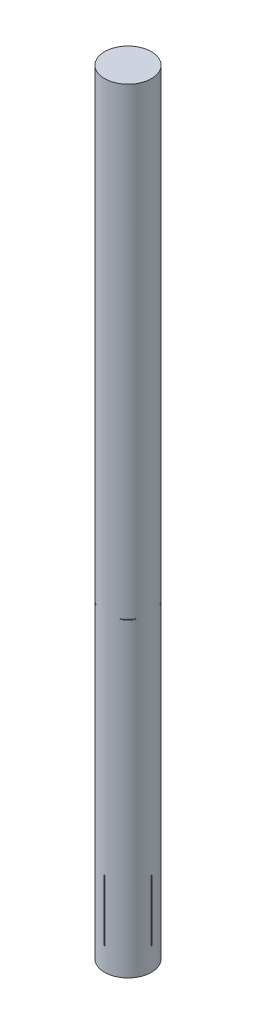
ISO-10303-21;
HEADER;
FILE_DESCRIPTION(('STEP AP214'),'2;1');
FILE_NAME('part.step','',(''),(''),'','','');
FILE_SCHEMA(('AUTOMOTIVE_DESIGN { 1 0 10303 214 1 1 1 1 }'));
ENDSEC;
DATA;
#1=APPLICATION_CONTEXT('core data for automotive mechanical design processes');
#2=APPLICATION_PROTOCOL_DEFINITION('international standard','automotive_design',2000,#1);
#3=PRODUCT_CONTEXT('',#1,'mechanical');
#4=PRODUCT('Part','Part','',(#3));
#5=PRODUCT_RELATED_PRODUCT_CATEGORY('part','',(#4));
#6=PRODUCT_DEFINITION_FORMATION('','',#4);
#7=PRODUCT_DEFINITION_CONTEXT('part definition',#1,'design');
#8=PRODUCT_DEFINITION('design','',#6,#7);
#9=PRODUCT_DEFINITION_SHAPE('','',#8);
#10=(LENGTH_UNIT() NAMED_UNIT(*) SI_UNIT(.MILLI.,.METRE.));
#11=(NAMED_UNIT(*) PLANE_ANGLE_UNIT() SI_UNIT($,.RADIAN.));
#12=(NAMED_UNIT(*) SI_UNIT($,.STERADIAN.) SOLID_ANGLE_UNIT());
#13=UNCERTAINTY_MEASURE_WITH_UNIT(LENGTH_MEASURE(1.E-05),#10,'distance_accuracy_value','');
#14=(GEOMETRIC_REPRESENTATION_CONTEXT(3) GLOBAL_UNCERTAINTY_ASSIGNED_CONTEXT((#13)) GLOBAL_UNIT_ASSIGNED_CONTEXT((#10,
#11,#12)) REPRESENTATION_CONTEXT('',''));
#15=CARTESIAN_POINT('',(0.,0.,0.));
#16=DIRECTION('',(0.,0.,1.));
#17=DIRECTION('',(1.,0.,0.));
#18=AXIS2_PLACEMENT_3D('',#15,#16,#17);
#19=CARTESIAN_POINT('',(0.,2565.4,0.));
#20=DIRECTION('',(0.,1.,0.));
#21=DIRECTION('',(0.,0.,1.));
#22=AXIS2_PLACEMENT_3D('',#19,#20,#21);
#23=PLANE('',#22);
#24=CARTESIAN_POINT('',(0.,2565.4,0.));
#25=DIRECTION('',(0.,1.,0.));
#26=DIRECTION('',(0.,0.,1.));
#27=AXIS2_PLACEMENT_3D('',#24,#25,#26);
#28=CIRCLE('',#27,77.6224);
#29=CARTESIAN_POINT('',(0.,2565.4,77.6224));
#30=VERTEX_POINT('',#29);
#31=EDGE_CURVE('E466',#30,#30,#28,.T.);
#32=ORIENTED_EDGE('',*,*,#31,.T.);
#33=EDGE_LOOP('',(#32));
#34=FACE_BOUND('',#33,.T.);
#35=ADVANCED_FACE('F39',(#34),#23,.T.);
#36=CARTESIAN_POINT('',(0.,0.,0.));
#37=DIRECTION('',(0.,1.,0.));
#38=DIRECTION('',(0.,0.,1.));
#39=AXIS2_PLACEMENT_3D('',#36,#37,#38);
#40=PLANE('',#39);
#41=CARTESIAN_POINT('',(0.,0.,0.));
#42=DIRECTION('',(0.,1.,0.));
#43=DIRECTION('',(0.,0.,1.));
#44=AXIS2_PLACEMENT_3D('',#41,#42,#43);
#45=CIRCLE('',#44,77.6224);
#46=CARTESIAN_POINT('',(0.,0.,77.6224));
#47=VERTEX_POINT('',#46);
#48=EDGE_CURVE('E465',#47,#47,#45,.T.);
#49=ORIENTED_EDGE('',*,*,#48,.F.);
#50=EDGE_LOOP('',(#49));
#51=FACE_BOUND('',#50,.T.);
#52=ADVANCED_FACE('F634',(#51),#40,.F.);
#53=CARTESIAN_POINT('',(0.,2565.4,0.));
#54=DIRECTION('',(0.,-1.,0.));
#55=DIRECTION('',(0.,0.,-1.));
#56=AXIS2_PLACEMENT_3D('',#53,#54,#55);
#57=CYLINDRICAL_SURFACE('',#56,77.6224);
#58=CARTESIAN_POINT('',(0.,1027.43,0.));
#59=DIRECTION('',(0.,-1.,0.));
#60=DIRECTION('',(0.,0.,-1.));
#61=AXIS2_PLACEMENT_3D('',#58,#59,#60);
#62=CIRCLE('',#61,77.6224);
#63=CARTESIAN_POINT('',(-66.6790981378722,1027.43,-39.7383297746638));
#64=VERTEX_POINT('',#63);
#65=CARTESIAN_POINT('',(-39.7383297746654,1027.43,-66.6790981378718));
#66=VERTEX_POINT('',#65);
#67=EDGE_CURVE('E316',#64,#66,#62,.T.);
#68=ORIENTED_EDGE('',*,*,#67,.T.);
#69=DIRECTION('',(0.,-1.,0.));
#70=VECTOR('',#69,1.);
#71=CARTESIAN_POINT('',(-39.7383297746638,2565.4,-66.6790981378728));
#72=LINE('',#71,#70);
#73=CARTESIAN_POINT('',(-39.7383297746654,1030.605,-66.6790981378718));
#74=VERTEX_POINT('',#73);
#75=EDGE_CURVE('E274',#66,#74,#72,.F.);
#76=ORIENTED_EDGE('',*,*,#75,.T.);
#77=CARTESIAN_POINT('',(0.,1030.605,0.));
#78=DIRECTION('',(0.,1.,0.));
#79=DIRECTION('',(0.,0.,1.));
#80=AXIS2_PLACEMENT_3D('',#77,#78,#79);
#81=CIRCLE('',#80,77.6224);
#82=CARTESIAN_POINT('',(-66.6790981378726,1030.605,-39.7383297746641));
#83=VERTEX_POINT('',#82);
#84=EDGE_CURVE('E264',#74,#83,#81,.T.);
#85=ORIENTED_EDGE('',*,*,#84,.T.);
#86=DIRECTION('',(0.,-1.,0.));
#87=VECTOR('',#86,1.);
#88=CARTESIAN_POINT('',(-66.6790981378735,2565.4,-39.7383297746625));
#89=LINE('',#88,#87);
#90=EDGE_CURVE('E312',#83,#64,#89,.T.);
#91=ORIENTED_EDGE('',*,*,#90,.T.);
#92=EDGE_LOOP('',(#68,#76,#85,#91));
#93=FACE_BOUND('',#92,.T.);
#94=CARTESIAN_POINT('',(-39.7383297746628,1027.43,66.6790981378734));
#95=VERTEX_POINT('',#94);
#96=CARTESIAN_POINT('',(-66.6790981378716,1027.43,39.7383297746648));
#97=VERTEX_POINT('',#96);
#98=EDGE_CURVE('E319',#95,#97,#62,.T.);
#99=ORIENTED_EDGE('',*,*,#98,.T.);
#100=DIRECTION('',(0.,-1.,0.));
#101=VECTOR('',#100,1.);
#102=CARTESIAN_POINT('',(-66.6790981378729,2565.4,39.7383297746636));
#103=LINE('',#102,#101);
#104=CARTESIAN_POINT('',(-66.6790981378716,1030.605,39.7383297746648));
#105=VERTEX_POINT('',#104);
#106=EDGE_CURVE('E303',#97,#105,#103,.F.);
#107=ORIENTED_EDGE('',*,*,#106,.T.);
#108=CARTESIAN_POINT('',(-39.738329774664,1030.605,66.6790981378721));
#109=VERTEX_POINT('',#108);
#110=EDGE_CURVE('E307',#105,#109,#81,.T.);
#111=ORIENTED_EDGE('',*,*,#110,.T.);
#112=DIRECTION('',(0.,-1.,0.));
#113=VECTOR('',#112,1.);
#114=CARTESIAN_POINT('',(-39.7383297746628,2565.4,66.6790981378734));
#115=LINE('',#114,#113);
#116=EDGE_CURVE('E284',#109,#95,#115,.T.);
#117=ORIENTED_EDGE('',*,*,#116,.T.);
#118=EDGE_LOOP('',(#99,#107,#111,#117));
#119=FACE_BOUND('',#118,.T.);
#120=CARTESIAN_POINT('',(39.7383297746643,1030.605,66.6790981378725));
#121=VERTEX_POINT('',#120);
#122=CARTESIAN_POINT('',(66.6790981378721,1030.605,39.7383297746649));
#123=VERTEX_POINT('',#122);
#124=EDGE_CURVE('E311',#121,#123,#81,.T.);
#125=ORIENTED_EDGE('',*,*,#124,.T.);
#126=DIRECTION('',(0.,-1.,0.));
#127=VECTOR('',#126,1.);
#128=CARTESIAN_POINT('',(66.679098137873,2565.4,39.7383297746633));
#129=LINE('',#128,#127);
#130=CARTESIAN_POINT('',(66.6790981378721,1027.43,39.7383297746649));
#131=VERTEX_POINT('',#130);
#132=EDGE_CURVE('E323',#123,#131,#129,.T.);
#133=ORIENTED_EDGE('',*,*,#132,.T.);
#134=CARTESIAN_POINT('',(39.7383297746655,1027.43,66.6790981378712));
#135=VERTEX_POINT('',#134);
#136=EDGE_CURVE('E320',#131,#135,#62,.T.);
#137=ORIENTED_EDGE('',*,*,#136,.T.);
#138=DIRECTION('',(0.,-1.,0.));
#139=VECTOR('',#138,1.);
#140=CARTESIAN_POINT('',(39.7383297746643,2565.4,66.6790981378725));
#141=LINE('',#140,#139);
#142=EDGE_CURVE('E278',#135,#121,#141,.F.);
#143=ORIENTED_EDGE('',*,*,#142,.T.);
#144=EDGE_LOOP('',(#125,#133,#137,#143));
#145=FACE_BOUND('',#144,.T.);
#146=CARTESIAN_POINT('',(0.,1027.43,0.));
#147=DIRECTION('',(0.,-1.,0.));
#148=DIRECTION('',(0.,0.,-1.));
#149=AXIS2_PLACEMENT_3D('',#146,#147,#148);
#150=CIRCLE('',#149,77.6224);
#151=CARTESIAN_POINT('',(39.738329774664,1027.43,-66.6790981378721));
#152=VERTEX_POINT('',#151);
#153=CARTESIAN_POINT('',(66.679098137872,1027.43,-39.7383297746651));
#154=VERTEX_POINT('',#153);
#155=EDGE_CURVE('E351',#152,#154,#150,.T.);
#156=ORIENTED_EDGE('',*,*,#155,.T.);
#157=DIRECTION('',(0.,-1.,0.));
#158=VECTOR('',#157,1.);
#159=CARTESIAN_POINT('',(66.6790981378729,2565.4,-39.7383297746636));
#160=LINE('',#159,#158);
#161=CARTESIAN_POINT('',(66.679098137872,1030.605,-39.7383297746651));
#162=VERTEX_POINT('',#161);
#163=EDGE_CURVE('E355',#154,#162,#160,.F.);
#164=ORIENTED_EDGE('',*,*,#163,.T.);
#165=CARTESIAN_POINT('',(0.,1030.605,0.));
#166=DIRECTION('',(0.,1.,0.));
#167=DIRECTION('',(0.,0.,1.));
#168=AXIS2_PLACEMENT_3D('',#165,#166,#167);
#169=CIRCLE('',#168,77.6224);
#170=CARTESIAN_POINT('',(39.7383297746643,1030.605,-66.6790981378724));
#171=VERTEX_POINT('',#170);
#172=EDGE_CURVE('E332',#162,#171,#169,.T.);
#173=ORIENTED_EDGE('',*,*,#172,.T.);
#174=DIRECTION('',(0.,-1.,0.));
#175=VECTOR('',#174,1.);
#176=CARTESIAN_POINT('',(39.7383297746628,2565.4,-66.6790981378734));
#177=LINE('',#176,#175);
#178=EDGE_CURVE('E347',#171,#152,#177,.T.);
#179=ORIENTED_EDGE('',*,*,#178,.T.);
#180=EDGE_LOOP('',(#156,#164,#173,#179));
#181=FACE_BOUND('',#180,.T.);
#182=DIRECTION('',(0.,-1.,0.));
#183=VECTOR('',#182,1.);
#184=CARTESIAN_POINT('',(-77.5858661754672,2565.4,-2.38124999999872));
#185=LINE('',#184,#183);
#186=CARTESIAN_POINT('',(-77.5858661754672,76.2,-2.38124999999949));
#187=VERTEX_POINT('',#186);
#188=CARTESIAN_POINT('',(-77.5858661754672,279.400000000001,-2.38124999999943));
#189=VERTEX_POINT('',#188);
#190=EDGE_CURVE('E426',#187,#189,#185,.F.);
#191=ORIENTED_EDGE('',*,*,#190,.T.);
#192=CARTESIAN_POINT('',(0.,279.400000000001,0.));
#193=DIRECTION('',(0.,1.,0.));
#194=DIRECTION('',(0.,0.,1.));
#195=AXIS2_PLACEMENT_3D('',#192,#193,#194);
#196=CIRCLE('',#195,77.6224);
#197=CARTESIAN_POINT('',(-77.5858661754671,279.400000000001,2.38125000000057));
#198=VERTEX_POINT('',#197);
#199=EDGE_CURVE('E416',#189,#198,#196,.T.);
#200=ORIENTED_EDGE('',*,*,#199,.T.);
#201=DIRECTION('',(0.,-1.,0.));
#202=VECTOR('',#201,1.);
#203=CARTESIAN_POINT('',(-77.5858661754671,2565.4,2.38125000000127));
#204=LINE('',#203,#202);
#205=CARTESIAN_POINT('',(-77.5858661754671,76.2,2.38125000000051));
#206=VERTEX_POINT('',#205);
#207=EDGE_CURVE('E418',#198,#206,#204,.T.);
#208=ORIENTED_EDGE('',*,*,#207,.T.);
#209=CARTESIAN_POINT('',(0.,76.2,0.));
#210=DIRECTION('',(0.,-1.,0.));
#211=DIRECTION('',(0.,0.,-1.));
#212=AXIS2_PLACEMENT_3D('',#209,#210,#211);
#213=CIRCLE('',#212,77.6224);
#214=EDGE_CURVE('E422',#206,#187,#213,.T.);
#215=ORIENTED_EDGE('',*,*,#214,.T.);
#216=EDGE_LOOP('',(#191,#200,#208,#215));
#217=FACE_BOUND('',#216,.T.);
#218=DIRECTION('',(0.,-1.,0.));
#219=VECTOR('',#218,1.);
#220=CARTESIAN_POINT('',(2.381250000001,2565.4,77.5858661754671));
#221=LINE('',#220,#219);
#222=CARTESIAN_POINT('',(2.3812500000003,279.4,77.5858661754671));
#223=VERTEX_POINT('',#222);
#224=CARTESIAN_POINT('',(2.381250000001,76.2,77.5858661754671));
#225=VERTEX_POINT('',#224);
#226=EDGE_CURVE('E405',#223,#225,#221,.T.);
#227=ORIENTED_EDGE('',*,*,#226,.T.);
#228=CARTESIAN_POINT('',(-2.38124999999977,76.2,77.5858661754672));
#229=VERTEX_POINT('',#228);
#230=EDGE_CURVE('E427',#225,#229,#213,.T.);
#231=ORIENTED_EDGE('',*,*,#230,.T.);
#232=DIRECTION('',(0.,-1.,0.));
#233=VECTOR('',#232,1.);
#234=CARTESIAN_POINT('',(-2.38124999999899,2565.4,77.5858661754672));
#235=LINE('',#234,#233);
#236=CARTESIAN_POINT('',(-2.3812499999997,279.4,77.5858661754672));
#237=VERTEX_POINT('',#236);
#238=EDGE_CURVE('E409',#229,#237,#235,.F.);
#239=ORIENTED_EDGE('',*,*,#238,.T.);
#240=EDGE_CURVE('E413',#237,#223,#196,.T.);
#241=ORIENTED_EDGE('',*,*,#240,.T.);
#242=EDGE_LOOP('',(#227,#231,#239,#241));
#243=FACE_BOUND('',#242,.T.);
#244=DIRECTION('',(0.,-1.,0.));
#245=VECTOR('',#244,1.);
#246=CARTESIAN_POINT('',(77.5858661754672,2565.4,-2.38124999999927));
#247=LINE('',#246,#245);
#248=CARTESIAN_POINT('',(77.5858661754672,279.400000000001,-2.38124999999997));
#249=VERTEX_POINT('',#248);
#250=CARTESIAN_POINT('',(77.5858661754672,76.2,-2.38125000000004));
#251=VERTEX_POINT('',#250);
#252=EDGE_CURVE('E431',#249,#251,#247,.T.);
#253=ORIENTED_EDGE('',*,*,#252,.T.);
#254=CARTESIAN_POINT('',(77.5858661754672,76.2,2.38124999999895));
#255=VERTEX_POINT('',#254);
#256=EDGE_CURVE('E423',#251,#255,#213,.T.);
#257=ORIENTED_EDGE('',*,*,#256,.T.);
#258=DIRECTION('',(0.,-1.,0.));
#259=VECTOR('',#258,1.);
#260=CARTESIAN_POINT('',(77.5858661754672,2565.4,2.38124999999818));
#261=LINE('',#260,#259);
#262=CARTESIAN_POINT('',(77.5858661754672,279.4,2.38124999999818));
#263=VERTEX_POINT('',#262);
#264=EDGE_CURVE('E401',#255,#263,#261,.F.);
#265=ORIENTED_EDGE('',*,*,#264,.T.);
#266=EDGE_CURVE('E417',#263,#249,#196,.T.);
#267=ORIENTED_EDGE('',*,*,#266,.T.);
#268=EDGE_LOOP('',(#253,#257,#265,#267));
#269=FACE_BOUND('',#268,.T.);
#270=DIRECTION('',(0.,-1.,0.));
#271=VECTOR('',#270,1.);
#272=CARTESIAN_POINT('',(2.38124999999899,2565.4,-77.5858661754672));
#273=LINE('',#272,#271);
#274=CARTESIAN_POINT('',(2.38124999999977,76.2,-77.5858661754672));
#275=VERTEX_POINT('',#274);
#276=CARTESIAN_POINT('',(2.3812499999997,279.4,-77.5858661754672));
#277=VERTEX_POINT('',#276);
#278=EDGE_CURVE('E461',#275,#277,#273,.F.);
#279=ORIENTED_EDGE('',*,*,#278,.T.);
#280=CARTESIAN_POINT('',(0.,279.4,0.));
#281=DIRECTION('',(0.,1.,0.));
#282=DIRECTION('',(0.,0.,1.));
#283=AXIS2_PLACEMENT_3D('',#280,#281,#282);
#284=CIRCLE('',#283,77.6224);
#285=CARTESIAN_POINT('',(-2.3812500000003,279.4,-77.5858661754672));
#286=VERTEX_POINT('',#285);
#287=EDGE_CURVE('E440',#277,#286,#284,.T.);
#288=ORIENTED_EDGE('',*,*,#287,.T.);
#289=DIRECTION('',(0.,-1.,0.));
#290=VECTOR('',#289,1.);
#291=CARTESIAN_POINT('',(-2.381250000001,2565.4,-77.5858661754671));
#292=LINE('',#291,#290);
#293=CARTESIAN_POINT('',(-2.38125000000024,76.2,-77.5858661754671));
#294=VERTEX_POINT('',#293);
#295=EDGE_CURVE('E454',#286,#294,#292,.T.);
#296=ORIENTED_EDGE('',*,*,#295,.T.);
#297=CARTESIAN_POINT('',(0.,76.2,0.));
#298=DIRECTION('',(0.,-1.,0.));
#299=DIRECTION('',(0.,0.,-1.));
#300=AXIS2_PLACEMENT_3D('',#297,#298,#299);
#301=CIRCLE('',#300,77.6224);
#302=EDGE_CURVE('E458',#294,#275,#301,.T.);
#303=ORIENTED_EDGE('',*,*,#302,.T.);
#304=EDGE_LOOP('',(#279,#288,#296,#303));
#305=FACE_BOUND('',#304,.T.);
#306=ORIENTED_EDGE('',*,*,#31,.F.);
#307=EDGE_LOOP('',(#306));
#308=FACE_BOUND('',#307,.T.);
#309=ORIENTED_EDGE('',*,*,#48,.T.);
#310=EDGE_LOOP('',(#309));
#311=FACE_BOUND('',#310,.T.);
#312=ADVANCED_FACE('F41',(#93,#119,#145,#181,#217,#243,#269,#305,#308,#311),#57,.T.);
#313=CARTESIAN_POINT('',(2.3812499999997,279.4,-77.6224));
#314=DIRECTION('',(1.,0.,0.));
#315=DIRECTION('',(0.,1.,0.));
#316=AXIS2_PLACEMENT_3D('',#313,#314,#315);
#317=PLANE('',#316);
#318=DIRECTION('',(0.,0.,1.));
#319=VECTOR('',#318,1.);
#320=CARTESIAN_POINT('',(2.38124999999977,76.2,-77.6224));
#321=LINE('',#320,#319);
#322=CARTESIAN_POINT('',(2.38124999999977,76.2,-76.162783880564));
#323=VERTEX_POINT('',#322);
#324=EDGE_CURVE('E436',#275,#323,#321,.T.);
#325=ORIENTED_EDGE('',*,*,#324,.T.);
#326=DIRECTION('',(0.,-1.,0.));
#327=VECTOR('',#326,1.);
#328=CARTESIAN_POINT('',(2.38124999999899,2565.4,-76.162783880564));
#329=LINE('',#328,#327);
#330=CARTESIAN_POINT('',(2.3812499999997,279.4,-76.162783880564));
#331=VERTEX_POINT('',#330);
#332=EDGE_CURVE('E485',#323,#331,#329,.F.);
#333=ORIENTED_EDGE('',*,*,#332,.T.);
#334=DIRECTION('',(0.,0.,1.));
#335=VECTOR('',#334,1.);
#336=CARTESIAN_POINT('',(2.3812499999997,279.4,-77.6224));
#337=LINE('',#336,#335);
#338=EDGE_CURVE('E435',#277,#331,#337,.T.);
#339=ORIENTED_EDGE('',*,*,#338,.F.);
#340=ORIENTED_EDGE('',*,*,#278,.F.);
#341=EDGE_LOOP('',(#325,#333,#339,#340));
#342=FACE_BOUND('',#341,.T.);
#343=ADVANCED_FACE('F643',(#342),#317,.F.);
#344=CARTESIAN_POINT('',(-2.38125000000024,76.2,-77.6224));
#345=DIRECTION('',(0.,-1.,0.));
#346=DIRECTION('',(0.,0.,-1.));
#347=AXIS2_PLACEMENT_3D('',#344,#345,#346);
#348=PLANE('',#347);
#349=ORIENTED_EDGE('',*,*,#302,.F.);
#350=DIRECTION('',(0.,0.,1.));
#351=VECTOR('',#350,1.);
#352=CARTESIAN_POINT('',(-2.38125000000024,76.2,-77.6224));
#353=LINE('',#352,#351);
#354=CARTESIAN_POINT('',(-2.381250000001,76.2,-76.1627838805639));
#355=VERTEX_POINT('',#354);
#356=EDGE_CURVE('E441',#294,#355,#353,.T.);
#357=ORIENTED_EDGE('',*,*,#356,.T.);
#358=CARTESIAN_POINT('',(0.,76.2,0.));
#359=DIRECTION('',(0.,-1.,0.));
#360=DIRECTION('',(0.,0.,-1.));
#361=AXIS2_PLACEMENT_3D('',#358,#359,#360);
#362=CIRCLE('',#361,76.2);
#363=EDGE_CURVE('E481',#355,#323,#362,.T.);
#364=ORIENTED_EDGE('',*,*,#363,.T.);
#365=ORIENTED_EDGE('',*,*,#324,.F.);
#366=EDGE_LOOP('',(#349,#357,#364,#365));
#367=FACE_BOUND('',#366,.T.);
#368=ADVANCED_FACE('F646',(#367),#348,.F.);
#369=CARTESIAN_POINT('',(-2.3812500000003,279.4,-77.6224));
#370=DIRECTION('',(-1.,0.,0.));
#371=DIRECTION('',(0.,-1.,0.));
#372=AXIS2_PLACEMENT_3D('',#369,#370,#371);
#373=PLANE('',#372);
#374=DIRECTION('',(0.,0.,1.));
#375=VECTOR('',#374,1.);
#376=CARTESIAN_POINT('',(-2.3812500000003,279.4,-77.6224));
#377=LINE('',#376,#375);
#378=CARTESIAN_POINT('',(-2.3812500000003,279.4,-76.162783880564));
#379=VERTEX_POINT('',#378);
#380=EDGE_CURVE('E445',#286,#379,#377,.T.);
#381=ORIENTED_EDGE('',*,*,#380,.T.);
#382=DIRECTION('',(0.,-1.,0.));
#383=VECTOR('',#382,1.);
#384=CARTESIAN_POINT('',(-2.381250000001,2565.4,-76.1627838805639));
#385=LINE('',#384,#383);
#386=EDGE_CURVE('E477',#379,#355,#385,.T.);
#387=ORIENTED_EDGE('',*,*,#386,.T.);
#388=ORIENTED_EDGE('',*,*,#356,.F.);
#389=ORIENTED_EDGE('',*,*,#295,.F.);
#390=EDGE_LOOP('',(#381,#387,#388,#389));
#391=FACE_BOUND('',#390,.T.);
#392=ADVANCED_FACE('F652',(#391),#373,.F.);
#393=CARTESIAN_POINT('',(-2.3812500000003,279.4,-77.6224));
#394=DIRECTION('',(0.,1.,0.));
#395=DIRECTION('',(0.,0.,1.));
#396=AXIS2_PLACEMENT_3D('',#393,#394,#395);
#397=PLANE('',#396);
#398=ORIENTED_EDGE('',*,*,#338,.T.);
#399=CARTESIAN_POINT('',(0.,279.4,0.));
#400=DIRECTION('',(0.,1.,0.));
#401=DIRECTION('',(0.,0.,1.));
#402=AXIS2_PLACEMENT_3D('',#399,#400,#401);
#403=CIRCLE('',#402,76.2);
#404=EDGE_CURVE('E470',#331,#379,#403,.T.);
#405=ORIENTED_EDGE('',*,*,#404,.T.);
#406=ORIENTED_EDGE('',*,*,#380,.F.);
#407=ORIENTED_EDGE('',*,*,#287,.F.);
#408=EDGE_LOOP('',(#398,#405,#406,#407));
#409=FACE_BOUND('',#408,.T.);
#410=ADVANCED_FACE('F648',(#409),#397,.F.);
#411=CARTESIAN_POINT('',(77.6224000000008,279.4,2.38124999999889));
#412=DIRECTION('',(0.,0.,1.));
#413=DIRECTION('',(1.,0.,0.));
#414=AXIS2_PLACEMENT_3D('',#411,#412,#413);
#415=PLANE('',#414);
#416=DIRECTION('',(-1.,0.,0.));
#417=VECTOR('',#416,1.);
#418=CARTESIAN_POINT('',(77.6224000000008,76.2,2.38124999999895));
#419=LINE('',#418,#417);
#420=CARTESIAN_POINT('',(76.1627838805641,76.2,2.3812499999982));
#421=VERTEX_POINT('',#420);
#422=EDGE_CURVE('E360',#255,#421,#419,.T.);
#423=ORIENTED_EDGE('',*,*,#422,.T.);
#424=DIRECTION('',(0.,-1.,0.));
#425=VECTOR('',#424,1.);
#426=CARTESIAN_POINT('',(76.162783880564,2565.4,2.3812499999982));
#427=LINE('',#426,#425);
#428=CARTESIAN_POINT('',(76.162783880564,279.400000000001,2.3812499999989));
#429=VERTEX_POINT('',#428);
#430=EDGE_CURVE('E489',#421,#429,#427,.F.);
#431=ORIENTED_EDGE('',*,*,#430,.T.);
#432=DIRECTION('',(-1.,0.,0.));
#433=VECTOR('',#432,1.);
#434=CARTESIAN_POINT('',(77.6224000000008,279.4,2.38124999999889));
#435=LINE('',#434,#433);
#436=EDGE_CURVE('E359',#263,#429,#435,.T.);
#437=ORIENTED_EDGE('',*,*,#436,.F.);
#438=ORIENTED_EDGE('',*,*,#264,.F.);
#439=EDGE_LOOP('',(#423,#431,#437,#438));
#440=FACE_BOUND('',#439,.T.);
#441=ADVANCED_FACE('F651',(#440),#415,.F.);
#442=CARTESIAN_POINT('',(-77.6224000000002,279.4,2.38125000000057));
#443=DIRECTION('',(0.,1.,0.));
#444=DIRECTION('',(0.,0.,1.));
#445=AXIS2_PLACEMENT_3D('',#442,#443,#444);
#446=PLANE('',#445);
#447=ORIENTED_EDGE('',*,*,#436,.T.);
#448=CARTESIAN_POINT('',(0.,279.400000000001,0.));
#449=DIRECTION('',(0.,1.,0.));
#450=DIRECTION('',(0.,0.,1.));
#451=AXIS2_PLACEMENT_3D('',#448,#449,#450);
#452=CIRCLE('',#451,76.2);
#453=CARTESIAN_POINT('',(76.162783880564,279.4,-2.38124999999926));
#454=VERTEX_POINT('',#453);
#455=EDGE_CURVE('E493',#429,#454,#452,.T.);
#456=ORIENTED_EDGE('',*,*,#455,.T.);
#457=DIRECTION('',(1.,0.,0.));
#458=VECTOR('',#457,1.);
#459=CARTESIAN_POINT('',(-77.6224000000003,279.4,-2.38124999999943));
#460=LINE('',#459,#458);
#461=EDGE_CURVE('E372',#454,#249,#460,.T.);
#462=ORIENTED_EDGE('',*,*,#461,.T.);
#463=ORIENTED_EDGE('',*,*,#266,.F.);
#464=EDGE_LOOP('',(#447,#456,#462,#463));
#465=FACE_BOUND('',#464,.T.);
#466=ADVANCED_FACE('F667',(#465),#446,.F.);
#467=CARTESIAN_POINT('',(-77.6224000000002,76.2,2.38125000000051));
#468=DIRECTION('',(0.,-1.,0.));
#469=DIRECTION('',(0.,0.,-1.));
#470=AXIS2_PLACEMENT_3D('',#467,#468,#469);
#471=PLANE('',#470);
#472=DIRECTION('',(1.,0.,0.));
#473=VECTOR('',#472,1.);
#474=CARTESIAN_POINT('',(-77.6224000000003,76.2,-2.38124999999949));
#475=LINE('',#474,#473);
#476=CARTESIAN_POINT('',(76.162783880564,76.2,-2.38125000000003));
#477=VERTEX_POINT('',#476);
#478=EDGE_CURVE('E384',#477,#251,#475,.T.);
#479=ORIENTED_EDGE('',*,*,#478,.F.);
#480=CARTESIAN_POINT('',(0.,76.2,0.));
#481=DIRECTION('',(0.,-1.,0.));
#482=DIRECTION('',(0.,0.,-1.));
#483=AXIS2_PLACEMENT_3D('',#480,#481,#482);
#484=CIRCLE('',#483,76.2);
#485=EDGE_CURVE('E497',#477,#421,#484,.T.);
#486=ORIENTED_EDGE('',*,*,#485,.T.);
#487=ORIENTED_EDGE('',*,*,#422,.F.);
#488=ORIENTED_EDGE('',*,*,#256,.F.);
#489=EDGE_LOOP('',(#479,#486,#487,#488));
#490=FACE_BOUND('',#489,.T.);
#491=ADVANCED_FACE('F664',(#490),#471,.F.);
#492=CARTESIAN_POINT('',(-77.6224000000003,279.4,-2.38124999999943));
#493=DIRECTION('',(0.,0.,-1.));
#494=DIRECTION('',(-1.,0.,0.));
#495=AXIS2_PLACEMENT_3D('',#492,#493,#494);
#496=PLANE('',#495);
#497=ORIENTED_EDGE('',*,*,#461,.F.);
#498=DIRECTION('',(0.,-1.,0.));
#499=VECTOR('',#498,1.);
#500=CARTESIAN_POINT('',(76.162783880564,2565.4,-2.38124999999926));
#501=LINE('',#500,#499);
#502=EDGE_CURVE('E503',#454,#477,#501,.T.);
#503=ORIENTED_EDGE('',*,*,#502,.T.);
#504=ORIENTED_EDGE('',*,*,#478,.T.);
#505=ORIENTED_EDGE('',*,*,#252,.F.);
#506=EDGE_LOOP('',(#497,#503,#504,#505));
#507=FACE_BOUND('',#506,.T.);
#508=ADVANCED_FACE('F660',(#507),#496,.F.);
#509=CARTESIAN_POINT('',(-2.3812499999997,279.4,77.6224));
#510=DIRECTION('',(-1.,0.,0.));
#511=DIRECTION('',(0.,-1.,0.));
#512=AXIS2_PLACEMENT_3D('',#509,#510,#511);
#513=PLANE('',#512);
#514=DIRECTION('',(0.,0.,-1.));
#515=VECTOR('',#514,1.);
#516=CARTESIAN_POINT('',(-2.38124999999977,76.2,77.6224));
#517=LINE('',#516,#515);
#518=CARTESIAN_POINT('',(-2.38124999999977,76.2,76.162783880564));
#519=VERTEX_POINT('',#518);
#520=EDGE_CURVE('E368',#229,#519,#517,.T.);
#521=ORIENTED_EDGE('',*,*,#520,.T.);
#522=DIRECTION('',(0.,-1.,0.));
#523=VECTOR('',#522,1.);
#524=CARTESIAN_POINT('',(-2.38124999999899,2565.4,76.162783880564));
#525=LINE('',#524,#523);
#526=CARTESIAN_POINT('',(-2.38124999999899,279.4,76.162783880564));
#527=VERTEX_POINT('',#526);
#528=EDGE_CURVE('E513',#519,#527,#525,.F.);
#529=ORIENTED_EDGE('',*,*,#528,.T.);
#530=DIRECTION('',(0.,0.,-1.));
#531=VECTOR('',#530,1.);
#532=CARTESIAN_POINT('',(-2.3812499999997,279.4,77.6224));
#533=LINE('',#532,#531);
#534=EDGE_CURVE('E364',#237,#527,#533,.T.);
#535=ORIENTED_EDGE('',*,*,#534,.F.);
#536=ORIENTED_EDGE('',*,*,#238,.F.);
#537=EDGE_LOOP('',(#521,#529,#535,#536));
#538=FACE_BOUND('',#537,.T.);
#539=ADVANCED_FACE('F663',(#538),#513,.F.);
#540=CARTESIAN_POINT('',(2.3812500000003,279.4,77.6224));
#541=DIRECTION('',(1.,0.,0.));
#542=DIRECTION('',(0.,1.,0.));
#543=AXIS2_PLACEMENT_3D('',#540,#541,#542);
#544=PLANE('',#543);
#545=DIRECTION('',(0.,0.,-1.));
#546=VECTOR('',#545,1.);
#547=CARTESIAN_POINT('',(2.3812500000003,279.4,77.6224));
#548=LINE('',#547,#546);
#549=CARTESIAN_POINT('',(2.381250000001,279.4,76.1627838805639));
#550=VERTEX_POINT('',#549);
#551=EDGE_CURVE('E377',#223,#550,#548,.T.);
#552=ORIENTED_EDGE('',*,*,#551,.T.);
#553=DIRECTION('',(0.,-1.,0.));
#554=VECTOR('',#553,1.);
#555=CARTESIAN_POINT('',(2.381250000001,2565.4,76.1627838805639));
#556=LINE('',#555,#554);
#557=CARTESIAN_POINT('',(2.38125000000024,76.2,76.162783880564));
#558=VERTEX_POINT('',#557);
#559=EDGE_CURVE('E509',#550,#558,#556,.T.);
#560=ORIENTED_EDGE('',*,*,#559,.T.);
#561=DIRECTION('',(0.,0.,-1.));
#562=VECTOR('',#561,1.);
#563=CARTESIAN_POINT('',(2.38125000000024,76.2,77.6224));
#564=LINE('',#563,#562);
#565=EDGE_CURVE('E373',#225,#558,#564,.T.);
#566=ORIENTED_EDGE('',*,*,#565,.F.);
#567=ORIENTED_EDGE('',*,*,#226,.F.);
#568=EDGE_LOOP('',(#552,#560,#566,#567));
#569=FACE_BOUND('',#568,.T.);
#570=ADVANCED_FACE('F684',(#569),#544,.F.);
#571=ORIENTED_EDGE('',*,*,#240,.F.);
#572=ORIENTED_EDGE('',*,*,#534,.T.);
#573=EDGE_CURVE('E499',#527,#550,#452,.T.);
#574=ORIENTED_EDGE('',*,*,#573,.T.);
#575=ORIENTED_EDGE('',*,*,#551,.F.);
#576=EDGE_LOOP('',(#571,#572,#574,#575));
#577=FACE_BOUND('',#576,.T.);
#578=ADVANCED_FACE('F672',(#577),#446,.F.);
#579=ORIENTED_EDGE('',*,*,#565,.T.);
#580=EDGE_CURVE('E505',#558,#519,#484,.T.);
#581=ORIENTED_EDGE('',*,*,#580,.T.);
#582=ORIENTED_EDGE('',*,*,#520,.F.);
#583=ORIENTED_EDGE('',*,*,#230,.F.);
#584=EDGE_LOOP('',(#579,#581,#582,#583));
#585=FACE_BOUND('',#584,.T.);
#586=ADVANCED_FACE('F681',(#585),#471,.F.);
#587=CARTESIAN_POINT('',(-76.162783880564,76.2,-2.3812499999995));
#588=VERTEX_POINT('',#587);
#589=EDGE_CURVE('E388',#187,#588,#475,.T.);
#590=ORIENTED_EDGE('',*,*,#589,.T.);
#591=DIRECTION('',(0.,-1.,0.));
#592=VECTOR('',#591,1.);
#593=CARTESIAN_POINT('',(-76.162783880564,2565.4,-2.38124999999873));
#594=LINE('',#593,#592);
#595=CARTESIAN_POINT('',(-76.162783880564,279.400000000001,-2.38124999999944));
#596=VERTEX_POINT('',#595);
#597=EDGE_CURVE('E521',#588,#596,#594,.F.);
#598=ORIENTED_EDGE('',*,*,#597,.T.);
#599=EDGE_CURVE('E397',#189,#596,#460,.T.);
#600=ORIENTED_EDGE('',*,*,#599,.F.);
#601=ORIENTED_EDGE('',*,*,#190,.F.);
#602=EDGE_LOOP('',(#590,#598,#600,#601));
#603=FACE_BOUND('',#602,.T.);
#604=ADVANCED_FACE('F666',(#603),#496,.F.);
#605=DIRECTION('',(1.,0.,0.));
#606=VECTOR('',#605,1.);
#607=CARTESIAN_POINT('',(-77.6224000000002,76.2,2.38125000000051));
#608=LINE('',#607,#606);
#609=CARTESIAN_POINT('',(-76.1627838805639,76.2,2.38125000000126));
#610=VERTEX_POINT('',#609);
#611=EDGE_CURVE('E389',#206,#610,#608,.T.);
#612=ORIENTED_EDGE('',*,*,#611,.T.);
#613=EDGE_CURVE('E504',#610,#588,#484,.T.);
#614=ORIENTED_EDGE('',*,*,#613,.T.);
#615=ORIENTED_EDGE('',*,*,#589,.F.);
#616=ORIENTED_EDGE('',*,*,#214,.F.);
#617=EDGE_LOOP('',(#612,#614,#615,#616));
#618=FACE_BOUND('',#617,.T.);
#619=ADVANCED_FACE('F676',(#618),#471,.F.);
#620=CARTESIAN_POINT('',(-77.6224000000002,279.4,2.38125000000057));
#621=DIRECTION('',(0.,0.,1.));
#622=DIRECTION('',(1.,0.,0.));
#623=AXIS2_PLACEMENT_3D('',#620,#621,#622);
#624=PLANE('',#623);
#625=DIRECTION('',(1.,0.,0.));
#626=VECTOR('',#625,1.);
#627=CARTESIAN_POINT('',(-77.6224000000002,279.4,2.38125000000057));
#628=LINE('',#627,#626);
#629=CARTESIAN_POINT('',(-76.162783880564,279.400000000001,2.38125000000056));
#630=VERTEX_POINT('',#629);
#631=EDGE_CURVE('E393',#198,#630,#628,.T.);
#632=ORIENTED_EDGE('',*,*,#631,.T.);
#633=DIRECTION('',(0.,-1.,0.));
#634=VECTOR('',#633,1.);
#635=CARTESIAN_POINT('',(-76.1627838805639,2565.4,2.38125000000126));
#636=LINE('',#635,#634);
#637=EDGE_CURVE('E517',#630,#610,#636,.T.);
#638=ORIENTED_EDGE('',*,*,#637,.T.);
#639=ORIENTED_EDGE('',*,*,#611,.F.);
#640=ORIENTED_EDGE('',*,*,#207,.F.);
#641=EDGE_LOOP('',(#632,#638,#639,#640));
#642=FACE_BOUND('',#641,.T.);
#643=ADVANCED_FACE('F673',(#642),#624,.F.);
#644=ORIENTED_EDGE('',*,*,#599,.T.);
#645=EDGE_CURVE('E498',#596,#630,#452,.T.);
#646=ORIENTED_EDGE('',*,*,#645,.T.);
#647=ORIENTED_EDGE('',*,*,#631,.F.);
#648=ORIENTED_EDGE('',*,*,#199,.F.);
#649=EDGE_LOOP('',(#644,#646,#647,#648));
#650=FACE_BOUND('',#649,.T.);
#651=ADVANCED_FACE('F671',(#650),#446,.F.);
#652=CARTESIAN_POINT('',(91.0927841816038,1030.605,-64.152015818397));
#653=DIRECTION('',(0.707106781186548,0.,0.707106781186547));
#654=DIRECTION('',(0.707106781186547,0.,-0.707106781186548));
#655=AXIS2_PLACEMENT_3D('',#652,#653,#654);
#656=PLANE('',#655);
#657=DIRECTION('',(-0.707106781186547,0.,0.707106781186548));
#658=VECTOR('',#657,1.);
#659=CARTESIAN_POINT('',(91.0927841816038,1027.43,-64.152015818397));
#660=LINE('',#659,#658);
#661=CARTESIAN_POINT('',(65.6409577839706,1027.43,-38.7001894207637));
#662=VERTEX_POINT('',#661);
#663=EDGE_CURVE('E328',#154,#662,#660,.T.);
#664=ORIENTED_EDGE('',*,*,#663,.T.);
#665=DIRECTION('',(0.,-1.,0.));
#666=VECTOR('',#665,1.);
#667=CARTESIAN_POINT('',(65.6409577839715,2565.4,-38.7001894207622));
#668=LINE('',#667,#666);
#669=CARTESIAN_POINT('',(65.6409577839706,1030.605,-38.7001894207637));
#670=VERTEX_POINT('',#669);
#671=EDGE_CURVE('E537',#662,#670,#668,.F.);
#672=ORIENTED_EDGE('',*,*,#671,.T.);
#673=DIRECTION('',(-0.707106781186547,0.,0.707106781186548));
#674=VECTOR('',#673,1.);
#675=CARTESIAN_POINT('',(91.0927841816038,1030.605,-64.152015818397));
#676=LINE('',#675,#674);
#677=EDGE_CURVE('E327',#162,#670,#676,.T.);
#678=ORIENTED_EDGE('',*,*,#677,.F.);
#679=ORIENTED_EDGE('',*,*,#163,.F.);
#680=EDGE_LOOP('',(#664,#672,#678,#679));
#681=FACE_BOUND('',#680,.T.);
#682=ADVANCED_FACE('F692',(#681),#656,.F.);
#683=CARTESIAN_POINT('',(64.1520158183964,1027.43,-91.0927841816045));
#684=DIRECTION('',(0.,-1.,0.));
#685=DIRECTION('',(0.,0.,-1.));
#686=AXIS2_PLACEMENT_3D('',#683,#684,#685);
#687=PLANE('',#686);
#688=DIRECTION('',(-0.707106781186547,0.,0.707106781186548));
#689=VECTOR('',#688,1.);
#690=CARTESIAN_POINT('',(64.1520158183964,1027.43,-91.0927841816045));
#691=LINE('',#690,#689);
#692=CARTESIAN_POINT('',(38.7001894207614,1027.43,-65.640957783972));
#693=VERTEX_POINT('',#692);
#694=EDGE_CURVE('E333',#152,#693,#691,.T.);
#695=ORIENTED_EDGE('',*,*,#694,.T.);
#696=CARTESIAN_POINT('',(0.,1027.43,0.));
#697=DIRECTION('',(0.,-1.,0.));
#698=DIRECTION('',(0.,0.,-1.));
#699=AXIS2_PLACEMENT_3D('',#696,#697,#698);
#700=CIRCLE('',#699,76.2);
#701=EDGE_CURVE('E533',#693,#662,#700,.T.);
#702=ORIENTED_EDGE('',*,*,#701,.T.);
#703=ORIENTED_EDGE('',*,*,#663,.F.);
#704=ORIENTED_EDGE('',*,*,#155,.F.);
#705=EDGE_LOOP('',(#695,#702,#703,#704));
#706=FACE_BOUND('',#705,.T.);
#707=ADVANCED_FACE('F695',(#706),#687,.F.);
#708=CARTESIAN_POINT('',(64.1520158183964,1030.605,-91.0927841816045));
#709=DIRECTION('',(-0.707106781186548,0.,-0.707106781186547));
#710=DIRECTION('',(-0.707106781186547,0.,0.707106781186548));
#711=AXIS2_PLACEMENT_3D('',#708,#709,#710);
#712=PLANE('',#711);
#713=DIRECTION('',(-0.707106781186547,0.,0.707106781186548));
#714=VECTOR('',#713,1.);
#715=CARTESIAN_POINT('',(64.1520158183964,1030.605,-91.0927841816045));
#716=LINE('',#715,#714);
#717=CARTESIAN_POINT('',(38.7001894207629,1030.605,-65.6409577839711));
#718=VERTEX_POINT('',#717);
#719=EDGE_CURVE('E337',#171,#718,#716,.T.);
#720=ORIENTED_EDGE('',*,*,#719,.T.);
#721=DIRECTION('',(0.,-1.,0.));
#722=VECTOR('',#721,1.);
#723=CARTESIAN_POINT('',(38.7001894207614,2565.4,-65.640957783972));
#724=LINE('',#723,#722);
#725=EDGE_CURVE('E529',#718,#693,#724,.T.);
#726=ORIENTED_EDGE('',*,*,#725,.T.);
#727=ORIENTED_EDGE('',*,*,#694,.F.);
#728=ORIENTED_EDGE('',*,*,#178,.F.);
#729=EDGE_LOOP('',(#720,#726,#727,#728));
#730=FACE_BOUND('',#729,.T.);
#731=ADVANCED_FACE('F700',(#730),#712,.F.);
#732=CARTESIAN_POINT('',(64.1520158183964,1030.605,-91.0927841816045));
#733=DIRECTION('',(0.,1.,0.));
#734=DIRECTION('',(0.,0.,1.));
#735=AXIS2_PLACEMENT_3D('',#732,#733,#734);
#736=PLANE('',#735);
#737=ORIENTED_EDGE('',*,*,#677,.T.);
#738=CARTESIAN_POINT('',(0.,1030.605,0.));
#739=DIRECTION('',(0.,1.,0.));
#740=DIRECTION('',(0.,0.,1.));
#741=AXIS2_PLACEMENT_3D('',#738,#739,#740);
#742=CIRCLE('',#741,76.2);
#743=EDGE_CURVE('E525',#670,#718,#742,.T.);
#744=ORIENTED_EDGE('',*,*,#743,.T.);
#745=ORIENTED_EDGE('',*,*,#719,.F.);
#746=ORIENTED_EDGE('',*,*,#172,.F.);
#747=EDGE_LOOP('',(#737,#744,#745,#746));
#748=FACE_BOUND('',#747,.T.);
#749=ADVANCED_FACE('F697',(#748),#736,.F.);
#750=CARTESIAN_POINT('',(64.152015818398,1030.605,91.0927841816032));
#751=DIRECTION('',(-0.70710678118654,0.,0.707106781186555));
#752=DIRECTION('',(0.707106781186555,0.,0.70710678118654));
#753=AXIS2_PLACEMENT_3D('',#750,#751,#752);
#754=PLANE('',#753);
#755=DIRECTION('',(-0.707106781186555,0.,-0.70710678118654));
#756=VECTOR('',#755,1.);
#757=CARTESIAN_POINT('',(64.152015818398,1027.43,91.0927841816032));
#758=LINE('',#757,#756);
#759=CARTESIAN_POINT('',(38.7001894207628,1027.43,65.6409577839711));
#760=VERTEX_POINT('',#759);
#761=EDGE_CURVE('E593',#135,#760,#758,.T.);
#762=ORIENTED_EDGE('',*,*,#761,.T.);
#763=DIRECTION('',(0.,-1.,0.));
#764=VECTOR('',#763,1.);
#765=CARTESIAN_POINT('',(38.7001894207628,2565.4,65.6409577839711));
#766=LINE('',#765,#764);
#767=CARTESIAN_POINT('',(38.7001894207644,1030.605,65.6409577839702));
#768=VERTEX_POINT('',#767);
#769=EDGE_CURVE('E541',#760,#768,#766,.F.);
#770=ORIENTED_EDGE('',*,*,#769,.T.);
#771=DIRECTION('',(-0.707106781186555,0.,-0.70710678118654));
#772=VECTOR('',#771,1.);
#773=CARTESIAN_POINT('',(64.152015818398,1030.605,91.0927841816032));
#774=LINE('',#773,#772);
#775=EDGE_CURVE('E589',#121,#768,#774,.T.);
#776=ORIENTED_EDGE('',*,*,#775,.F.);
#777=ORIENTED_EDGE('',*,*,#142,.F.);
#778=EDGE_LOOP('',(#762,#770,#776,#777));
#779=FACE_BOUND('',#778,.T.);
#780=ADVANCED_FACE('F605',(#779),#754,.F.);
#781=CARTESIAN_POINT('',(-91.0927841816044,1030.605,-64.1520158183958));
#782=DIRECTION('',(0.,1.,0.));
#783=DIRECTION('',(0.,0.,1.));
#784=AXIS2_PLACEMENT_3D('',#781,#782,#783);
#785=PLANE('',#784);
#786=ORIENTED_EDGE('',*,*,#775,.T.);
#787=CARTESIAN_POINT('',(0.,1030.605,0.));
#788=DIRECTION('',(0.,1.,0.));
#789=DIRECTION('',(0.,0.,1.));
#790=AXIS2_PLACEMENT_3D('',#787,#788,#789);
#791=CIRCLE('',#790,76.2);
#792=CARTESIAN_POINT('',(65.6409577839716,1030.605,38.7001894207619));
#793=VERTEX_POINT('',#792);
#794=EDGE_CURVE('E259',#768,#793,#791,.T.);
#795=ORIENTED_EDGE('',*,*,#794,.T.);
#796=DIRECTION('',(0.70710678118655,0.,0.707106781186545));
#797=VECTOR('',#796,1.);
#798=CARTESIAN_POINT('',(-64.152015818397,1030.605,-91.0927841816033));
#799=LINE('',#798,#797);
#800=EDGE_CURVE('E268',#793,#123,#799,.T.);
#801=ORIENTED_EDGE('',*,*,#800,.T.);
#802=ORIENTED_EDGE('',*,*,#124,.F.);
#803=EDGE_LOOP('',(#786,#795,#801,#802));
#804=FACE_BOUND('',#803,.T.);
#805=ADVANCED_FACE('F602',(#804),#785,.F.);
#806=CARTESIAN_POINT('',(-91.0927841816044,1027.43,-64.1520158183958));
#807=DIRECTION('',(0.,-1.,0.));
#808=DIRECTION('',(0.,0.,-1.));
#809=AXIS2_PLACEMENT_3D('',#806,#807,#808);
#810=PLANE('',#809);
#811=DIRECTION('',(0.70710678118655,0.,0.707106781186545));
#812=VECTOR('',#811,1.);
#813=CARTESIAN_POINT('',(-64.152015818397,1027.43,-91.0927841816033));
#814=LINE('',#813,#812);
#815=CARTESIAN_POINT('',(65.6409577839707,1027.43,38.7001894207635));
#816=VERTEX_POINT('',#815);
#817=EDGE_CURVE('E279',#816,#131,#814,.T.);
#818=ORIENTED_EDGE('',*,*,#817,.F.);
#819=CARTESIAN_POINT('',(0.,1027.43,0.));
#820=DIRECTION('',(0.,-1.,0.));
#821=DIRECTION('',(0.,0.,-1.));
#822=AXIS2_PLACEMENT_3D('',#819,#820,#821);
#823=CIRCLE('',#822,76.2);
#824=EDGE_CURVE('E547',#816,#760,#823,.T.);
#825=ORIENTED_EDGE('',*,*,#824,.T.);
#826=ORIENTED_EDGE('',*,*,#761,.F.);
#827=ORIENTED_EDGE('',*,*,#136,.F.);
#828=EDGE_LOOP('',(#818,#825,#826,#827));
#829=FACE_BOUND('',#828,.T.);
#830=ADVANCED_FACE('F612',(#829),#810,.F.);
#831=CARTESIAN_POINT('',(-64.152015818397,1030.605,-91.0927841816033));
#832=DIRECTION('',(0.707106781186545,0.,-0.70710678118655));
#833=DIRECTION('',(-0.70710678118655,0.,-0.707106781186545));
#834=AXIS2_PLACEMENT_3D('',#831,#832,#833);
#835=PLANE('',#834);
#836=ORIENTED_EDGE('',*,*,#800,.F.);
#837=DIRECTION('',(0.,-1.,0.));
#838=VECTOR('',#837,1.);
#839=CARTESIAN_POINT('',(65.6409577839716,2565.4,38.7001894207619));
#840=LINE('',#839,#838);
#841=EDGE_CURVE('E551',#793,#816,#840,.T.);
#842=ORIENTED_EDGE('',*,*,#841,.T.);
#843=ORIENTED_EDGE('',*,*,#817,.T.);
#844=ORIENTED_EDGE('',*,*,#132,.F.);
#845=EDGE_LOOP('',(#836,#842,#843,#844));
#846=FACE_BOUND('',#845,.T.);
#847=ADVANCED_FACE('F610',(#846),#835,.F.);
#848=CARTESIAN_POINT('',(-64.1520158183961,1030.605,91.0927841816042));
#849=DIRECTION('',(0.707106781186548,0.,0.707106781186547));
#850=DIRECTION('',(0.707106781186547,0.,-0.707106781186548));
#851=AXIS2_PLACEMENT_3D('',#848,#849,#850);
#852=PLANE('',#851);
#853=DIRECTION('',(0.707106781186547,0.,-0.707106781186548));
#854=VECTOR('',#853,1.);
#855=CARTESIAN_POINT('',(-64.1520158183961,1030.605,91.0927841816042));
#856=LINE('',#855,#854);
#857=CARTESIAN_POINT('',(-38.7001894207614,1030.605,65.640957783972));
#858=VERTEX_POINT('',#857);
#859=EDGE_CURVE('E577',#109,#858,#856,.T.);
#860=ORIENTED_EDGE('',*,*,#859,.T.);
#861=DIRECTION('',(0.,-1.,0.));
#862=VECTOR('',#861,1.);
#863=CARTESIAN_POINT('',(-38.7001894207614,2565.4,65.640957783972));
#864=LINE('',#863,#862);
#865=CARTESIAN_POINT('',(-38.700189420763,1027.43,65.640957783971));
#866=VERTEX_POINT('',#865);
#867=EDGE_CURVE('E556',#858,#866,#864,.T.);
#868=ORIENTED_EDGE('',*,*,#867,.T.);
#869=DIRECTION('',(0.707106781186547,0.,-0.707106781186548));
#870=VECTOR('',#869,1.);
#871=CARTESIAN_POINT('',(-64.1520158183961,1027.43,91.0927841816042));
#872=LINE('',#871,#870);
#873=EDGE_CURVE('E63',#95,#866,#872,.T.);
#874=ORIENTED_EDGE('',*,*,#873,.F.);
#875=ORIENTED_EDGE('',*,*,#116,.F.);
#876=EDGE_LOOP('',(#860,#868,#874,#875));
#877=FACE_BOUND('',#876,.T.);
#878=ADVANCED_FACE('F708',(#877),#852,.F.);
#879=CARTESIAN_POINT('',(-91.0927841816036,1030.605,64.1520158183967));
#880=DIRECTION('',(-0.707106781186548,0.,-0.707106781186547));
#881=DIRECTION('',(-0.707106781186547,0.,0.707106781186548));
#882=AXIS2_PLACEMENT_3D('',#879,#880,#881);
#883=PLANE('',#882);
#884=DIRECTION('',(0.707106781186547,0.,-0.707106781186548));
#885=VECTOR('',#884,1.);
#886=CARTESIAN_POINT('',(-91.0927841816036,1027.43,64.1520158183967));
#887=LINE('',#886,#885);
#888=CARTESIAN_POINT('',(-65.6409577839703,1027.43,38.7001894207634));
#889=VERTEX_POINT('',#888);
#890=EDGE_CURVE('E298',#97,#889,#887,.T.);
#891=ORIENTED_EDGE('',*,*,#890,.T.);
#892=DIRECTION('',(0.,-1.,0.));
#893=VECTOR('',#892,1.);
#894=CARTESIAN_POINT('',(-65.6409577839715,2565.4,38.7001894207621));
#895=LINE('',#894,#893);
#896=CARTESIAN_POINT('',(-65.6409577839715,1030.605,38.7001894207621));
#897=VERTEX_POINT('',#896);
#898=EDGE_CURVE('E256',#889,#897,#895,.F.);
#899=ORIENTED_EDGE('',*,*,#898,.T.);
#900=DIRECTION('',(0.707106781186547,0.,-0.707106781186548));
#901=VECTOR('',#900,1.);
#902=CARTESIAN_POINT('',(-91.0927841816036,1030.605,64.1520158183967));
#903=LINE('',#902,#901);
#904=EDGE_CURVE('E290',#105,#897,#903,.T.);
#905=ORIENTED_EDGE('',*,*,#904,.F.);
#906=ORIENTED_EDGE('',*,*,#106,.F.);
#907=EDGE_LOOP('',(#891,#899,#905,#906));
#908=FACE_BOUND('',#907,.T.);
#909=ADVANCED_FACE('F582',(#908),#883,.F.);
#910=ORIENTED_EDGE('',*,*,#904,.T.);
#911=EDGE_CURVE('E258',#897,#858,#791,.T.);
#912=ORIENTED_EDGE('',*,*,#911,.T.);
#913=ORIENTED_EDGE('',*,*,#859,.F.);
#914=ORIENTED_EDGE('',*,*,#110,.F.);
#915=EDGE_LOOP('',(#910,#912,#913,#914));
#916=FACE_BOUND('',#915,.T.);
#917=ADVANCED_FACE('F575',(#916),#785,.F.);
#918=ORIENTED_EDGE('',*,*,#873,.T.);
#919=EDGE_CURVE('E552',#866,#889,#823,.T.);
#920=ORIENTED_EDGE('',*,*,#919,.T.);
#921=ORIENTED_EDGE('',*,*,#890,.F.);
#922=ORIENTED_EDGE('',*,*,#98,.F.);
#923=EDGE_LOOP('',(#918,#920,#921,#922));
#924=FACE_BOUND('',#923,.T.);
#925=ADVANCED_FACE('F618',(#924),#810,.F.);
#926=CARTESIAN_POINT('',(-38.700189420764,1027.43,-65.6409577839704));
#927=VERTEX_POINT('',#926);
#928=EDGE_CURVE('E273',#66,#927,#814,.T.);
#929=ORIENTED_EDGE('',*,*,#928,.T.);
#930=DIRECTION('',(0.,-1.,0.));
#931=VECTOR('',#930,1.);
#932=CARTESIAN_POINT('',(-38.7001894207624,2565.4,-65.6409577839714));
#933=LINE('',#932,#931);
#934=CARTESIAN_POINT('',(-38.700189420764,1030.605,-65.6409577839704));
#935=VERTEX_POINT('',#934);
#936=EDGE_CURVE('E11',#927,#935,#933,.F.);
#937=ORIENTED_EDGE('',*,*,#936,.T.);
#938=EDGE_CURVE('E261',#74,#935,#799,.T.);
#939=ORIENTED_EDGE('',*,*,#938,.F.);
#940=ORIENTED_EDGE('',*,*,#75,.F.);
#941=EDGE_LOOP('',(#929,#937,#939,#940));
#942=FACE_BOUND('',#941,.T.);
#943=ADVANCED_FACE('F271',(#942),#835,.F.);
#944=DIRECTION('',(0.70710678118655,0.,0.707106781186545));
#945=VECTOR('',#944,1.);
#946=CARTESIAN_POINT('',(-91.0927841816044,1027.43,-64.1520158183958));
#947=LINE('',#946,#945);
#948=CARTESIAN_POINT('',(-65.6409577839721,1027.43,-38.7001894207611));
#949=VERTEX_POINT('',#948);
#950=EDGE_CURVE('E287',#64,#949,#947,.T.);
#951=ORIENTED_EDGE('',*,*,#950,.T.);
#952=EDGE_CURVE('E48',#949,#927,#823,.T.);
#953=ORIENTED_EDGE('',*,*,#952,.T.);
#954=ORIENTED_EDGE('',*,*,#928,.F.);
#955=ORIENTED_EDGE('',*,*,#67,.F.);
#956=EDGE_LOOP('',(#951,#953,#954,#955));
#957=FACE_BOUND('',#956,.T.);
#958=ADVANCED_FACE('F621',(#957),#810,.F.);
#959=CARTESIAN_POINT('',(-91.0927841816044,1030.605,-64.1520158183958));
#960=DIRECTION('',(-0.707106781186545,0.,0.70710678118655));
#961=DIRECTION('',(0.70710678118655,0.,0.707106781186545));
#962=AXIS2_PLACEMENT_3D('',#959,#960,#961);
#963=PLANE('',#962);
#964=DIRECTION('',(0.70710678118655,0.,0.707106781186545));
#965=VECTOR('',#964,1.);
#966=CARTESIAN_POINT('',(-91.0927841816044,1030.605,-64.1520158183958));
#967=LINE('',#966,#965);
#968=CARTESIAN_POINT('',(-65.6409577839712,1030.605,-38.7001894207627));
#969=VERTEX_POINT('',#968);
#970=EDGE_CURVE('E55',#83,#969,#967,.T.);
#971=ORIENTED_EDGE('',*,*,#970,.T.);
#972=DIRECTION('',(0.,-1.,0.));
#973=VECTOR('',#972,1.);
#974=CARTESIAN_POINT('',(-65.6409577839721,2565.4,-38.7001894207611));
#975=LINE('',#974,#973);
#976=EDGE_CURVE('E254',#969,#949,#975,.T.);
#977=ORIENTED_EDGE('',*,*,#976,.T.);
#978=ORIENTED_EDGE('',*,*,#950,.F.);
#979=ORIENTED_EDGE('',*,*,#90,.F.);
#980=EDGE_LOOP('',(#971,#977,#978,#979));
#981=FACE_BOUND('',#980,.T.);
#982=ADVANCED_FACE('F631',(#981),#963,.F.);
#983=ORIENTED_EDGE('',*,*,#938,.T.);
#984=EDGE_CURVE('E249',#935,#969,#791,.T.);
#985=ORIENTED_EDGE('',*,*,#984,.T.);
#986=ORIENTED_EDGE('',*,*,#970,.F.);
#987=ORIENTED_EDGE('',*,*,#84,.F.);
#988=EDGE_LOOP('',(#983,#985,#986,#987));
#989=FACE_BOUND('',#988,.T.);
#990=ADVANCED_FACE('F262',(#989),#785,.F.);
#991=CARTESIAN_POINT('',(0.,2565.4,0.));
#992=DIRECTION('',(0.,-1.,0.));
#993=DIRECTION('',(0.,0.,-1.));
#994=AXIS2_PLACEMENT_3D('',#991,#992,#993);
#995=CYLINDRICAL_SURFACE('',#994,76.2);
#996=ORIENTED_EDGE('',*,*,#936,.F.);
#997=ORIENTED_EDGE('',*,*,#952,.F.);
#998=ORIENTED_EDGE('',*,*,#976,.F.);
#999=ORIENTED_EDGE('',*,*,#984,.F.);
#1000=EDGE_LOOP('',(#996,#997,#998,#999));
#1001=FACE_BOUND('',#1000,.T.);
#1002=ADVANCED_FACE('F251',(#1001),#995,.T.);
#1003=ORIENTED_EDGE('',*,*,#911,.F.);
#1004=ORIENTED_EDGE('',*,*,#898,.F.);
#1005=ORIENTED_EDGE('',*,*,#919,.F.);
#1006=ORIENTED_EDGE('',*,*,#867,.F.);
#1007=EDGE_LOOP('',(#1003,#1004,#1005,#1006));
#1008=FACE_BOUND('',#1007,.T.);
#1009=ADVANCED_FACE('F580',(#1008),#995,.T.);
#1010=ORIENTED_EDGE('',*,*,#769,.F.);
#1011=ORIENTED_EDGE('',*,*,#824,.F.);
#1012=ORIENTED_EDGE('',*,*,#841,.F.);
#1013=ORIENTED_EDGE('',*,*,#794,.F.);
#1014=EDGE_LOOP('',(#1010,#1011,#1012,#1013));
#1015=FACE_BOUND('',#1014,.T.);
#1016=ADVANCED_FACE('F607',(#1015),#995,.T.);
#1017=ORIENTED_EDGE('',*,*,#671,.F.);
#1018=ORIENTED_EDGE('',*,*,#701,.F.);
#1019=ORIENTED_EDGE('',*,*,#725,.F.);
#1020=ORIENTED_EDGE('',*,*,#743,.F.);
#1021=EDGE_LOOP('',(#1017,#1018,#1019,#1020));
#1022=FACE_BOUND('',#1021,.T.);
#1023=ADVANCED_FACE('F754',(#1022),#995,.T.);
#1024=ORIENTED_EDGE('',*,*,#597,.F.);
#1025=ORIENTED_EDGE('',*,*,#613,.F.);
#1026=ORIENTED_EDGE('',*,*,#637,.F.);
#1027=ORIENTED_EDGE('',*,*,#645,.F.);
#1028=EDGE_LOOP('',(#1024,#1025,#1026,#1027));
#1029=FACE_BOUND('',#1028,.T.);
#1030=ADVANCED_FACE('F758',(#1029),#995,.T.);
#1031=ORIENTED_EDGE('',*,*,#573,.F.);
#1032=ORIENTED_EDGE('',*,*,#528,.F.);
#1033=ORIENTED_EDGE('',*,*,#580,.F.);
#1034=ORIENTED_EDGE('',*,*,#559,.F.);
#1035=EDGE_LOOP('',(#1031,#1032,#1033,#1034));
#1036=FACE_BOUND('',#1035,.T.);
#1037=ADVANCED_FACE('F744',(#1036),#995,.T.);
#1038=ORIENTED_EDGE('',*,*,#430,.F.);
#1039=ORIENTED_EDGE('',*,*,#485,.F.);
#1040=ORIENTED_EDGE('',*,*,#502,.F.);
#1041=ORIENTED_EDGE('',*,*,#455,.F.);
#1042=EDGE_LOOP('',(#1038,#1039,#1040,#1041));
#1043=FACE_BOUND('',#1042,.T.);
#1044=ADVANCED_FACE('F739',(#1043),#995,.T.);
#1045=ORIENTED_EDGE('',*,*,#332,.F.);
#1046=ORIENTED_EDGE('',*,*,#363,.F.);
#1047=ORIENTED_EDGE('',*,*,#386,.F.);
#1048=ORIENTED_EDGE('',*,*,#404,.F.);
#1049=EDGE_LOOP('',(#1045,#1046,#1047,#1048));
#1050=FACE_BOUND('',#1049,.T.);
#1051=ADVANCED_FACE('F736',(#1050),#995,.T.);
#1052=CLOSED_SHELL('',(#35,#52,#312,#343,#368,#392,#410,#441,#466,#491,#508,#539,#570,#578,#586,
#604,#619,#643,#651,#682,#707,#731,#749,#780,#805,#830,#847,#878,#909,#917,#925,#943,#958,#982,
#990,#1002,#1009,#1016,#1023,#1030,#1037,#1044,#1051));
#1053=MANIFOLD_SOLID_BREP('B2',#1052);
#1054=ADVANCED_BREP_SHAPE_REPRESENTATION('',(#18,#1053),#14);
#1055=SHAPE_DEFINITION_REPRESENTATION(#9,#1054);
ENDSEC;
END-ISO-10303-21;
